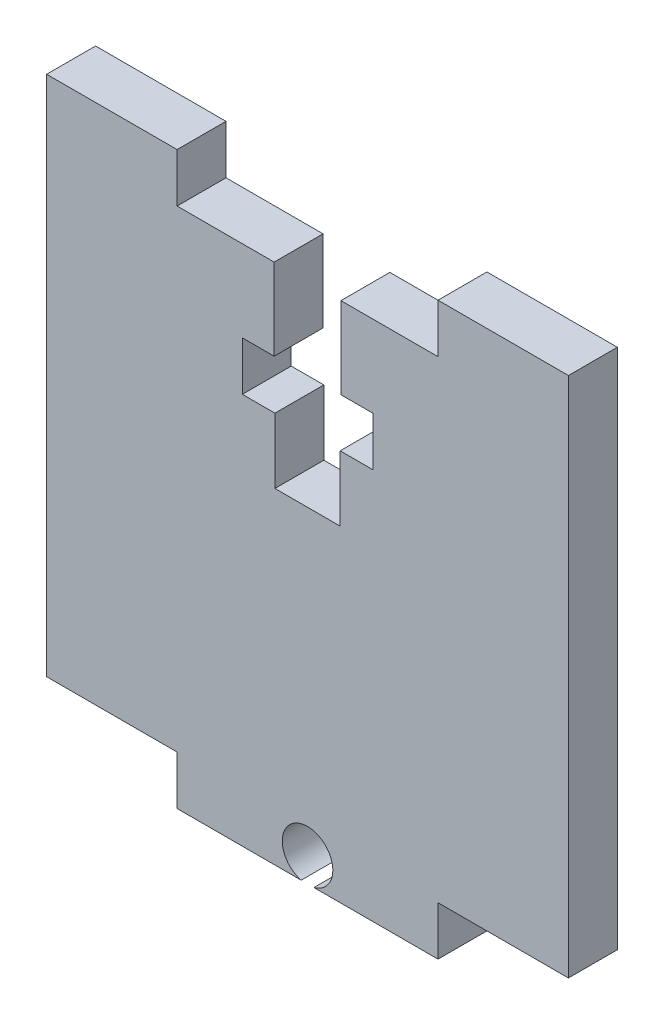
ISO-10303-21;
HEADER;
FILE_DESCRIPTION(('STEP AP214'),'2;1');
FILE_NAME('part.step','',(''),(''),'','','');
FILE_SCHEMA(('AUTOMOTIVE_DESIGN { 1 0 10303 214 1 1 1 1 }'));
ENDSEC;
DATA;
#1=APPLICATION_CONTEXT('core data for automotive mechanical design processes');
#2=APPLICATION_PROTOCOL_DEFINITION('international standard','automotive_design',2000,#1);
#3=PRODUCT_CONTEXT('',#1,'mechanical');
#4=PRODUCT('Part','Part','',(#3));
#5=PRODUCT_RELATED_PRODUCT_CATEGORY('part','',(#4));
#6=PRODUCT_DEFINITION_FORMATION('','',#4);
#7=PRODUCT_DEFINITION_CONTEXT('part definition',#1,'design');
#8=PRODUCT_DEFINITION('design','',#6,#7);
#9=PRODUCT_DEFINITION_SHAPE('','',#8);
#10=(LENGTH_UNIT() NAMED_UNIT(*) SI_UNIT(.MILLI.,.METRE.));
#11=(NAMED_UNIT(*) PLANE_ANGLE_UNIT() SI_UNIT($,.RADIAN.));
#12=(NAMED_UNIT(*) SI_UNIT($,.STERADIAN.) SOLID_ANGLE_UNIT());
#13=UNCERTAINTY_MEASURE_WITH_UNIT(LENGTH_MEASURE(1.E-05),#10,'distance_accuracy_value','');
#14=(GEOMETRIC_REPRESENTATION_CONTEXT(3) GLOBAL_UNCERTAINTY_ASSIGNED_CONTEXT((#13)) GLOBAL_UNIT_ASSIGNED_CONTEXT((#10,
#11,#12)) REPRESENTATION_CONTEXT('',''));
#15=CARTESIAN_POINT('',(0.,0.,0.));
#16=DIRECTION('',(0.,0.,1.));
#17=DIRECTION('',(1.,0.,0.));
#18=AXIS2_PLACEMENT_3D('',#15,#16,#17);
#19=CARTESIAN_POINT('',(8.,48.8553054771042,3.));
#20=DIRECTION('',(1.,0.,0.));
#21=DIRECTION('',(0.,0.,-1.));
#22=AXIS2_PLACEMENT_3D('',#19,#20,#21);
#23=PLANE('',#22);
#24=DIRECTION('',(0.,-1.,0.));
#25=VECTOR('',#24,1.);
#26=CARTESIAN_POINT('',(8.,48.8553054771042,0.));
#27=LINE('',#26,#25);
#28=CARTESIAN_POINT('',(8.,51.8553054771042,0.));
#29=VERTEX_POINT('',#28);
#30=CARTESIAN_POINT('',(8.,48.8553054771042,0.));
#31=VERTEX_POINT('',#30);
#32=EDGE_CURVE('E237',#29,#31,#27,.T.);
#33=ORIENTED_EDGE('',*,*,#32,.T.);
#34=DIRECTION('',(0.,0.,-1.));
#35=VECTOR('',#34,1.);
#36=CARTESIAN_POINT('',(8.,48.8553054771042,3.));
#37=LINE('',#36,#35);
#38=CARTESIAN_POINT('',(8.,48.8553054771042,3.));
#39=VERTEX_POINT('',#38);
#40=EDGE_CURVE('E11',#39,#31,#37,.T.);
#41=ORIENTED_EDGE('',*,*,#40,.F.);
#42=DIRECTION('',(0.,-1.,0.));
#43=VECTOR('',#42,1.);
#44=CARTESIAN_POINT('',(8.,48.8553054771042,3.));
#45=LINE('',#44,#43);
#46=CARTESIAN_POINT('',(8.,51.8553054771042,3.));
#47=VERTEX_POINT('',#46);
#48=EDGE_CURVE('E287',#47,#39,#45,.T.);
#49=ORIENTED_EDGE('',*,*,#48,.F.);
#50=DIRECTION('',(0.,0.,-1.));
#51=VECTOR('',#50,1.);
#52=CARTESIAN_POINT('',(8.,51.8553054771042,3.));
#53=LINE('',#52,#51);
#54=EDGE_CURVE('E233',#47,#29,#53,.T.);
#55=ORIENTED_EDGE('',*,*,#54,.T.);
#56=EDGE_LOOP('',(#33,#41,#49,#55));
#57=FACE_BOUND('',#56,.T.);
#58=ADVANCED_FACE('F33',(#57),#23,.F.);
#59=CARTESIAN_POINT('',(2.04789002341845,48.8553054771042,3.));
#60=DIRECTION('',(0.,-1.,0.));
#61=DIRECTION('',(0.,0.,-1.));
#62=AXIS2_PLACEMENT_3D('',#59,#60,#61);
#63=PLANE('',#62);
#64=DIRECTION('',(-1.,0.,0.));
#65=VECTOR('',#64,1.);
#66=CARTESIAN_POINT('',(2.04789002341845,48.8553054771042,0.));
#67=LINE('',#66,#65);
#68=CARTESIAN_POINT('',(2.04789002341845,48.8553054771042,0.));
#69=VERTEX_POINT('',#68);
#70=EDGE_CURVE('E240',#31,#69,#67,.T.);
#71=ORIENTED_EDGE('',*,*,#70,.T.);
#72=DIRECTION('',(0.,0.,-1.));
#73=VECTOR('',#72,1.);
#74=CARTESIAN_POINT('',(2.04789002341845,48.8553054771042,3.));
#75=LINE('',#74,#73);
#76=CARTESIAN_POINT('',(2.04789002341845,48.8553054771042,3.));
#77=VERTEX_POINT('',#76);
#78=EDGE_CURVE('E41',#77,#69,#75,.T.);
#79=ORIENTED_EDGE('',*,*,#78,.F.);
#80=DIRECTION('',(-1.,0.,0.));
#81=VECTOR('',#80,1.);
#82=CARTESIAN_POINT('',(2.04789002341845,48.8553054771042,3.));
#83=LINE('',#82,#81);
#84=EDGE_CURVE('E146',#39,#77,#83,.T.);
#85=ORIENTED_EDGE('',*,*,#84,.F.);
#86=ORIENTED_EDGE('',*,*,#40,.T.);
#87=EDGE_LOOP('',(#71,#79,#85,#86));
#88=FACE_BOUND('',#87,.T.);
#89=ADVANCED_FACE('F435',(#88),#63,.F.);
#90=CARTESIAN_POINT('',(2.04789002341845,48.8553054771042,3.));
#91=DIRECTION('',(1.,0.,0.));
#92=DIRECTION('',(0.,1.,0.));
#93=AXIS2_PLACEMENT_3D('',#90,#91,#92);
#94=PLANE('',#93);
#95=DIRECTION('',(0.,-1.,0.));
#96=VECTOR('',#95,1.);
#97=CARTESIAN_POINT('',(2.04789002341845,48.8553054771042,0.));
#98=LINE('',#97,#96);
#99=CARTESIAN_POINT('',(2.04789002341845,43.8553054771042,0.));
#100=VERTEX_POINT('',#99);
#101=EDGE_CURVE('E242',#69,#100,#98,.T.);
#102=ORIENTED_EDGE('',*,*,#101,.T.);
#103=DIRECTION('',(0.,0.,-1.));
#104=VECTOR('',#103,1.);
#105=CARTESIAN_POINT('',(2.04789002341845,43.8553054771042,3.));
#106=LINE('',#105,#104);
#107=CARTESIAN_POINT('',(2.04789002341845,43.8553054771042,3.));
#108=VERTEX_POINT('',#107);
#109=EDGE_CURVE('E348',#108,#100,#106,.T.);
#110=ORIENTED_EDGE('',*,*,#109,.F.);
#111=DIRECTION('',(0.,-1.,0.));
#112=VECTOR('',#111,1.);
#113=CARTESIAN_POINT('',(2.04789002341845,48.8553054771042,3.));
#114=LINE('',#113,#112);
#115=EDGE_CURVE('E356',#77,#108,#114,.T.);
#116=ORIENTED_EDGE('',*,*,#115,.F.);
#117=ORIENTED_EDGE('',*,*,#78,.T.);
#118=EDGE_LOOP('',(#102,#110,#116,#117));
#119=FACE_BOUND('',#118,.T.);
#120=ADVANCED_FACE('F354',(#119),#94,.F.);
#121=CARTESIAN_POINT('',(2.04789002341845,43.8553054771042,3.));
#122=DIRECTION('',(0.,1.,0.));
#123=DIRECTION('',(-1.,0.,0.));
#124=AXIS2_PLACEMENT_3D('',#121,#122,#123);
#125=PLANE('',#124);
#126=DIRECTION('',(1.,0.,0.));
#127=VECTOR('',#126,1.);
#128=CARTESIAN_POINT('',(2.04789002341845,43.8553054771042,0.));
#129=LINE('',#128,#127);
#130=CARTESIAN_POINT('',(4.,43.8553054771042,0.));
#131=VERTEX_POINT('',#130);
#132=EDGE_CURVE('E244',#100,#131,#129,.T.);
#133=ORIENTED_EDGE('',*,*,#132,.T.);
#134=DIRECTION('',(0.,0.,-1.));
#135=VECTOR('',#134,1.);
#136=CARTESIAN_POINT('',(4.,43.8553054771042,3.));
#137=LINE('',#136,#135);
#138=CARTESIAN_POINT('',(4.,43.8553054771042,3.));
#139=VERTEX_POINT('',#138);
#140=EDGE_CURVE('E345',#139,#131,#137,.T.);
#141=ORIENTED_EDGE('',*,*,#140,.F.);
#142=DIRECTION('',(1.,0.,0.));
#143=VECTOR('',#142,1.);
#144=CARTESIAN_POINT('',(2.04789002341845,43.8553054771042,3.));
#145=LINE('',#144,#143);
#146=EDGE_CURVE('E374',#108,#139,#145,.T.);
#147=ORIENTED_EDGE('',*,*,#146,.F.);
#148=ORIENTED_EDGE('',*,*,#109,.T.);
#149=EDGE_LOOP('',(#133,#141,#147,#148));
#150=FACE_BOUND('',#149,.T.);
#151=ADVANCED_FACE('F365',(#150),#125,.F.);
#152=CARTESIAN_POINT('',(4.,43.8553054771042,3.));
#153=DIRECTION('',(1.,0.,0.));
#154=DIRECTION('',(0.,1.,0.));
#155=AXIS2_PLACEMENT_3D('',#152,#153,#154);
#156=PLANE('',#155);
#157=DIRECTION('',(0.,-1.,0.));
#158=VECTOR('',#157,1.);
#159=CARTESIAN_POINT('',(4.,43.8553054771042,0.));
#160=LINE('',#159,#158);
#161=CARTESIAN_POINT('',(4.,40.8553054771042,0.));
#162=VERTEX_POINT('',#161);
#163=EDGE_CURVE('E246',#131,#162,#160,.T.);
#164=ORIENTED_EDGE('',*,*,#163,.T.);
#165=DIRECTION('',(0.,0.,-1.));
#166=VECTOR('',#165,1.);
#167=CARTESIAN_POINT('',(4.,40.8553054771042,3.));
#168=LINE('',#167,#166);
#169=CARTESIAN_POINT('',(4.,40.8553054771042,3.));
#170=VERTEX_POINT('',#169);
#171=EDGE_CURVE('E342',#170,#162,#168,.T.);
#172=ORIENTED_EDGE('',*,*,#171,.F.);
#173=DIRECTION('',(0.,-1.,0.));
#174=VECTOR('',#173,1.);
#175=CARTESIAN_POINT('',(4.,43.8553054771042,3.));
#176=LINE('',#175,#174);
#177=EDGE_CURVE('E371',#139,#170,#176,.T.);
#178=ORIENTED_EDGE('',*,*,#177,.F.);
#179=ORIENTED_EDGE('',*,*,#140,.T.);
#180=EDGE_LOOP('',(#164,#172,#178,#179));
#181=FACE_BOUND('',#180,.T.);
#182=ADVANCED_FACE('F369',(#181),#156,.F.);
#183=CARTESIAN_POINT('',(4.,40.8553054771042,3.));
#184=DIRECTION('',(0.,-1.,0.));
#185=DIRECTION('',(0.,0.,-1.));
#186=AXIS2_PLACEMENT_3D('',#183,#184,#185);
#187=PLANE('',#186);
#188=DIRECTION('',(-1.,0.,0.));
#189=VECTOR('',#188,1.);
#190=CARTESIAN_POINT('',(4.,40.8553054771042,0.));
#191=LINE('',#190,#189);
#192=CARTESIAN_POINT('',(2.,40.8553054771042,0.));
#193=VERTEX_POINT('',#192);
#194=EDGE_CURVE('E248',#162,#193,#191,.T.);
#195=ORIENTED_EDGE('',*,*,#194,.T.);
#196=DIRECTION('',(0.,0.,-1.));
#197=VECTOR('',#196,1.);
#198=CARTESIAN_POINT('',(2.,40.8553054771042,3.));
#199=LINE('',#198,#197);
#200=CARTESIAN_POINT('',(2.,40.8553054771042,3.));
#201=VERTEX_POINT('',#200);
#202=EDGE_CURVE('E339',#201,#193,#199,.T.);
#203=ORIENTED_EDGE('',*,*,#202,.F.);
#204=DIRECTION('',(-1.,0.,0.));
#205=VECTOR('',#204,1.);
#206=CARTESIAN_POINT('',(4.,40.8553054771042,3.));
#207=LINE('',#206,#205);
#208=EDGE_CURVE('E373',#170,#201,#207,.T.);
#209=ORIENTED_EDGE('',*,*,#208,.F.);
#210=ORIENTED_EDGE('',*,*,#171,.T.);
#211=EDGE_LOOP('',(#195,#203,#209,#210));
#212=FACE_BOUND('',#211,.T.);
#213=ADVANCED_FACE('F448',(#212),#187,.F.);
#214=CARTESIAN_POINT('',(2.,40.8553054771042,3.));
#215=DIRECTION('',(1.,0.,0.));
#216=DIRECTION('',(0.,1.,0.));
#217=AXIS2_PLACEMENT_3D('',#214,#215,#216);
#218=PLANE('',#217);
#219=DIRECTION('',(0.,-1.,0.));
#220=VECTOR('',#219,1.);
#221=CARTESIAN_POINT('',(2.,40.8553054771042,0.));
#222=LINE('',#221,#220);
#223=CARTESIAN_POINT('',(2.,36.8553054771042,0.));
#224=VERTEX_POINT('',#223);
#225=EDGE_CURVE('E250',#193,#224,#222,.T.);
#226=ORIENTED_EDGE('',*,*,#225,.T.);
#227=DIRECTION('',(0.,0.,-1.));
#228=VECTOR('',#227,1.);
#229=CARTESIAN_POINT('',(2.,36.8553054771042,3.));
#230=LINE('',#229,#228);
#231=CARTESIAN_POINT('',(2.,36.8553054771042,3.));
#232=VERTEX_POINT('',#231);
#233=EDGE_CURVE('E336',#232,#224,#230,.T.);
#234=ORIENTED_EDGE('',*,*,#233,.F.);
#235=DIRECTION('',(0.,-1.,0.));
#236=VECTOR('',#235,1.);
#237=CARTESIAN_POINT('',(2.,40.8553054771042,3.));
#238=LINE('',#237,#236);
#239=EDGE_CURVE('E376',#201,#232,#238,.T.);
#240=ORIENTED_EDGE('',*,*,#239,.F.);
#241=ORIENTED_EDGE('',*,*,#202,.T.);
#242=EDGE_LOOP('',(#226,#234,#240,#241));
#243=FACE_BOUND('',#242,.T.);
#244=ADVANCED_FACE('F451',(#243),#218,.F.);
#245=CARTESIAN_POINT('',(2.,36.8553054771042,3.));
#246=DIRECTION('',(0.,-1.,0.));
#247=DIRECTION('',(0.,0.,-1.));
#248=AXIS2_PLACEMENT_3D('',#245,#246,#247);
#249=PLANE('',#248);
#250=DIRECTION('',(-1.,0.,0.));
#251=VECTOR('',#250,1.);
#252=CARTESIAN_POINT('',(2.,36.8553054771042,0.));
#253=LINE('',#252,#251);
#254=CARTESIAN_POINT('',(-2.,36.8553054771042,0.));
#255=VERTEX_POINT('',#254);
#256=EDGE_CURVE('E252',#224,#255,#253,.T.);
#257=ORIENTED_EDGE('',*,*,#256,.T.);
#258=DIRECTION('',(0.,0.,-1.));
#259=VECTOR('',#258,1.);
#260=CARTESIAN_POINT('',(-2.,36.8553054771042,3.));
#261=LINE('',#260,#259);
#262=CARTESIAN_POINT('',(-2.,36.8553054771042,3.));
#263=VERTEX_POINT('',#262);
#264=EDGE_CURVE('E333',#263,#255,#261,.T.);
#265=ORIENTED_EDGE('',*,*,#264,.F.);
#266=DIRECTION('',(-1.,0.,0.));
#267=VECTOR('',#266,1.);
#268=CARTESIAN_POINT('',(2.,36.8553054771042,3.));
#269=LINE('',#268,#267);
#270=EDGE_CURVE('E382',#232,#263,#269,.T.);
#271=ORIENTED_EDGE('',*,*,#270,.F.);
#272=ORIENTED_EDGE('',*,*,#233,.T.);
#273=EDGE_LOOP('',(#257,#265,#271,#272));
#274=FACE_BOUND('',#273,.T.);
#275=ADVANCED_FACE('F455',(#274),#249,.F.);
#276=CARTESIAN_POINT('',(-2.,40.8553054771042,3.));
#277=DIRECTION('',(-1.,0.,0.));
#278=DIRECTION('',(0.,-1.,0.));
#279=AXIS2_PLACEMENT_3D('',#276,#277,#278);
#280=PLANE('',#279);
#281=DIRECTION('',(0.,1.,0.));
#282=VECTOR('',#281,1.);
#283=CARTESIAN_POINT('',(-2.,40.8553054771042,0.));
#284=LINE('',#283,#282);
#285=CARTESIAN_POINT('',(-2.,40.8553054771042,0.));
#286=VERTEX_POINT('',#285);
#287=EDGE_CURVE('E254',#255,#286,#284,.T.);
#288=ORIENTED_EDGE('',*,*,#287,.T.);
#289=DIRECTION('',(0.,0.,-1.));
#290=VECTOR('',#289,1.);
#291=CARTESIAN_POINT('',(-2.,40.8553054771042,3.));
#292=LINE('',#291,#290);
#293=CARTESIAN_POINT('',(-2.,40.8553054771042,3.));
#294=VERTEX_POINT('',#293);
#295=EDGE_CURVE('E330',#294,#286,#292,.T.);
#296=ORIENTED_EDGE('',*,*,#295,.F.);
#297=DIRECTION('',(0.,1.,0.));
#298=VECTOR('',#297,1.);
#299=CARTESIAN_POINT('',(-2.,40.8553054771042,3.));
#300=LINE('',#299,#298);
#301=EDGE_CURVE('E384',#263,#294,#300,.T.);
#302=ORIENTED_EDGE('',*,*,#301,.F.);
#303=ORIENTED_EDGE('',*,*,#264,.T.);
#304=EDGE_LOOP('',(#288,#296,#302,#303));
#305=FACE_BOUND('',#304,.T.);
#306=ADVANCED_FACE('F459',(#305),#280,.F.);
#307=CARTESIAN_POINT('',(-4.00000000000001,40.8553054771042,3.));
#308=DIRECTION('',(0.,-1.,0.));
#309=DIRECTION('',(0.,0.,-1.));
#310=AXIS2_PLACEMENT_3D('',#307,#308,#309);
#311=PLANE('',#310);
#312=DIRECTION('',(-1.,0.,0.));
#313=VECTOR('',#312,1.);
#314=CARTESIAN_POINT('',(-4.00000000000001,40.8553054771042,0.));
#315=LINE('',#314,#313);
#316=CARTESIAN_POINT('',(-4.00000000000001,40.8553054771042,0.));
#317=VERTEX_POINT('',#316);
#318=EDGE_CURVE('E256',#286,#317,#315,.T.);
#319=ORIENTED_EDGE('',*,*,#318,.T.);
#320=DIRECTION('',(0.,0.,-1.));
#321=VECTOR('',#320,1.);
#322=CARTESIAN_POINT('',(-4.00000000000001,40.8553054771042,3.));
#323=LINE('',#322,#321);
#324=CARTESIAN_POINT('',(-4.00000000000001,40.8553054771042,3.));
#325=VERTEX_POINT('',#324);
#326=EDGE_CURVE('E327',#325,#317,#323,.T.);
#327=ORIENTED_EDGE('',*,*,#326,.F.);
#328=DIRECTION('',(-1.,0.,0.));
#329=VECTOR('',#328,1.);
#330=CARTESIAN_POINT('',(-4.00000000000001,40.8553054771042,3.));
#331=LINE('',#330,#329);
#332=EDGE_CURVE('E386',#294,#325,#331,.T.);
#333=ORIENTED_EDGE('',*,*,#332,.F.);
#334=ORIENTED_EDGE('',*,*,#295,.T.);
#335=EDGE_LOOP('',(#319,#327,#333,#334));
#336=FACE_BOUND('',#335,.T.);
#337=ADVANCED_FACE('F463',(#336),#311,.F.);
#338=CARTESIAN_POINT('',(-4.,43.8553054771042,3.));
#339=DIRECTION('',(-1.,0.,0.));
#340=DIRECTION('',(0.,-1.,0.));
#341=AXIS2_PLACEMENT_3D('',#338,#339,#340);
#342=PLANE('',#341);
#343=DIRECTION('',(0.,1.,0.));
#344=VECTOR('',#343,1.);
#345=CARTESIAN_POINT('',(-4.,43.8553054771042,0.));
#346=LINE('',#345,#344);
#347=CARTESIAN_POINT('',(-4.,43.8553054771042,0.));
#348=VERTEX_POINT('',#347);
#349=EDGE_CURVE('E258',#317,#348,#346,.T.);
#350=ORIENTED_EDGE('',*,*,#349,.T.);
#351=DIRECTION('',(0.,0.,-1.));
#352=VECTOR('',#351,1.);
#353=CARTESIAN_POINT('',(-4.,43.8553054771042,3.));
#354=LINE('',#353,#352);
#355=CARTESIAN_POINT('',(-4.,43.8553054771042,3.));
#356=VERTEX_POINT('',#355);
#357=EDGE_CURVE('E324',#356,#348,#354,.T.);
#358=ORIENTED_EDGE('',*,*,#357,.F.);
#359=DIRECTION('',(0.,1.,0.));
#360=VECTOR('',#359,1.);
#361=CARTESIAN_POINT('',(-4.,43.8553054771042,3.));
#362=LINE('',#361,#360);
#363=EDGE_CURVE('E388',#325,#356,#362,.T.);
#364=ORIENTED_EDGE('',*,*,#363,.F.);
#365=ORIENTED_EDGE('',*,*,#326,.T.);
#366=EDGE_LOOP('',(#350,#358,#364,#365));
#367=FACE_BOUND('',#366,.T.);
#368=ADVANCED_FACE('F467',(#367),#342,.F.);
#369=CARTESIAN_POINT('',(-2.04789002341846,43.8553054771042,3.));
#370=DIRECTION('',(0.,1.,0.));
#371=DIRECTION('',(-1.,0.,0.));
#372=AXIS2_PLACEMENT_3D('',#369,#370,#371);
#373=PLANE('',#372);
#374=DIRECTION('',(1.,0.,0.));
#375=VECTOR('',#374,1.);
#376=CARTESIAN_POINT('',(-2.04789002341846,43.8553054771042,0.));
#377=LINE('',#376,#375);
#378=CARTESIAN_POINT('',(-2.04789002341846,43.8553054771042,0.));
#379=VERTEX_POINT('',#378);
#380=EDGE_CURVE('E260',#348,#379,#377,.T.);
#381=ORIENTED_EDGE('',*,*,#380,.T.);
#382=DIRECTION('',(0.,0.,-1.));
#383=VECTOR('',#382,1.);
#384=CARTESIAN_POINT('',(-2.04789002341846,43.8553054771042,3.));
#385=LINE('',#384,#383);
#386=CARTESIAN_POINT('',(-2.04789002341846,43.8553054771042,3.));
#387=VERTEX_POINT('',#386);
#388=EDGE_CURVE('E321',#387,#379,#385,.T.);
#389=ORIENTED_EDGE('',*,*,#388,.F.);
#390=DIRECTION('',(1.,0.,0.));
#391=VECTOR('',#390,1.);
#392=CARTESIAN_POINT('',(-2.04789002341846,43.8553054771042,3.));
#393=LINE('',#392,#391);
#394=EDGE_CURVE('E390',#356,#387,#393,.T.);
#395=ORIENTED_EDGE('',*,*,#394,.F.);
#396=ORIENTED_EDGE('',*,*,#357,.T.);
#397=EDGE_LOOP('',(#381,#389,#395,#396));
#398=FACE_BOUND('',#397,.T.);
#399=ADVANCED_FACE('F471',(#398),#373,.F.);
#400=CARTESIAN_POINT('',(-2.04789002341846,48.8553054771042,3.));
#401=DIRECTION('',(-1.,0.,0.));
#402=DIRECTION('',(0.,-1.,0.));
#403=AXIS2_PLACEMENT_3D('',#400,#401,#402);
#404=PLANE('',#403);
#405=DIRECTION('',(0.,1.,0.));
#406=VECTOR('',#405,1.);
#407=CARTESIAN_POINT('',(-2.04789002341846,48.8553054771042,0.));
#408=LINE('',#407,#406);
#409=CARTESIAN_POINT('',(-2.04789002341846,48.8553054771042,0.));
#410=VERTEX_POINT('',#409);
#411=EDGE_CURVE('E262',#379,#410,#408,.T.);
#412=ORIENTED_EDGE('',*,*,#411,.T.);
#413=DIRECTION('',(0.,0.,-1.));
#414=VECTOR('',#413,1.);
#415=CARTESIAN_POINT('',(-2.04789002341846,48.8553054771042,3.));
#416=LINE('',#415,#414);
#417=CARTESIAN_POINT('',(-2.04789002341846,48.8553054771042,3.));
#418=VERTEX_POINT('',#417);
#419=EDGE_CURVE('E318',#418,#410,#416,.T.);
#420=ORIENTED_EDGE('',*,*,#419,.F.);
#421=DIRECTION('',(0.,1.,0.));
#422=VECTOR('',#421,1.);
#423=CARTESIAN_POINT('',(-2.04789002341846,48.8553054771042,3.));
#424=LINE('',#423,#422);
#425=EDGE_CURVE('E392',#387,#418,#424,.T.);
#426=ORIENTED_EDGE('',*,*,#425,.F.);
#427=ORIENTED_EDGE('',*,*,#388,.T.);
#428=EDGE_LOOP('',(#412,#420,#426,#427));
#429=FACE_BOUND('',#428,.T.);
#430=ADVANCED_FACE('F475',(#429),#404,.F.);
#431=CARTESIAN_POINT('',(-2.04789002341846,48.8553054771042,3.));
#432=DIRECTION('',(0.,-1.,0.));
#433=DIRECTION('',(0.,0.,-1.));
#434=AXIS2_PLACEMENT_3D('',#431,#432,#433);
#435=PLANE('',#434);
#436=DIRECTION('',(-1.,0.,0.));
#437=VECTOR('',#436,1.);
#438=CARTESIAN_POINT('',(-2.04789002341846,48.8553054771042,0.));
#439=LINE('',#438,#437);
#440=CARTESIAN_POINT('',(-8.00000000000001,48.8553054771042,0.));
#441=VERTEX_POINT('',#440);
#442=EDGE_CURVE('E264',#410,#441,#439,.T.);
#443=ORIENTED_EDGE('',*,*,#442,.T.);
#444=DIRECTION('',(0.,0.,-1.));
#445=VECTOR('',#444,1.);
#446=CARTESIAN_POINT('',(-8.00000000000001,48.8553054771042,3.));
#447=LINE('',#446,#445);
#448=CARTESIAN_POINT('',(-8.00000000000001,48.8553054771042,3.));
#449=VERTEX_POINT('',#448);
#450=EDGE_CURVE('E315',#449,#441,#447,.T.);
#451=ORIENTED_EDGE('',*,*,#450,.F.);
#452=DIRECTION('',(-1.,0.,0.));
#453=VECTOR('',#452,1.);
#454=CARTESIAN_POINT('',(-2.04789002341846,48.8553054771042,3.));
#455=LINE('',#454,#453);
#456=EDGE_CURVE('E394',#418,#449,#455,.T.);
#457=ORIENTED_EDGE('',*,*,#456,.F.);
#458=ORIENTED_EDGE('',*,*,#419,.T.);
#459=EDGE_LOOP('',(#443,#451,#457,#458));
#460=FACE_BOUND('',#459,.T.);
#461=ADVANCED_FACE('F479',(#460),#435,.F.);
#462=CARTESIAN_POINT('',(-8.00000000000001,48.8553054771042,3.));
#463=DIRECTION('',(-1.,0.,0.));
#464=DIRECTION('',(0.,0.,1.));
#465=AXIS2_PLACEMENT_3D('',#462,#463,#464);
#466=PLANE('',#465);
#467=DIRECTION('',(0.,1.,0.));
#468=VECTOR('',#467,1.);
#469=CARTESIAN_POINT('',(-8.00000000000001,48.8553054771042,0.));
#470=LINE('',#469,#468);
#471=CARTESIAN_POINT('',(-8.00000000000001,51.8553054771042,0.));
#472=VERTEX_POINT('',#471);
#473=EDGE_CURVE('E266',#441,#472,#470,.T.);
#474=ORIENTED_EDGE('',*,*,#473,.T.);
#475=DIRECTION('',(0.,0.,-1.));
#476=VECTOR('',#475,1.);
#477=CARTESIAN_POINT('',(-8.00000000000001,51.8553054771042,3.));
#478=LINE('',#477,#476);
#479=CARTESIAN_POINT('',(-8.00000000000001,51.8553054771042,3.));
#480=VERTEX_POINT('',#479);
#481=EDGE_CURVE('E312',#480,#472,#478,.T.);
#482=ORIENTED_EDGE('',*,*,#481,.F.);
#483=DIRECTION('',(0.,1.,0.));
#484=VECTOR('',#483,1.);
#485=CARTESIAN_POINT('',(-8.00000000000001,48.8553054771042,3.));
#486=LINE('',#485,#484);
#487=EDGE_CURVE('E396',#449,#480,#486,.T.);
#488=ORIENTED_EDGE('',*,*,#487,.F.);
#489=ORIENTED_EDGE('',*,*,#450,.T.);
#490=EDGE_LOOP('',(#474,#482,#488,#489));
#491=FACE_BOUND('',#490,.T.);
#492=ADVANCED_FACE('F483',(#491),#466,.F.);
#493=CARTESIAN_POINT('',(-8.00000000000001,51.8553054771042,3.));
#494=DIRECTION('',(0.,-1.,0.));
#495=DIRECTION('',(0.,0.,-1.));
#496=AXIS2_PLACEMENT_3D('',#493,#494,#495);
#497=PLANE('',#496);
#498=DIRECTION('',(-1.,0.,0.));
#499=VECTOR('',#498,1.);
#500=CARTESIAN_POINT('',(-8.00000000000001,51.8553054771042,0.));
#501=LINE('',#500,#499);
#502=CARTESIAN_POINT('',(-16.,51.8553054771042,0.));
#503=VERTEX_POINT('',#502);
#504=EDGE_CURVE('E268',#472,#503,#501,.T.);
#505=ORIENTED_EDGE('',*,*,#504,.T.);
#506=DIRECTION('',(0.,0.,-1.));
#507=VECTOR('',#506,1.);
#508=CARTESIAN_POINT('',(-16.,51.8553054771042,3.));
#509=LINE('',#508,#507);
#510=CARTESIAN_POINT('',(-16.,51.8553054771042,3.));
#511=VERTEX_POINT('',#510);
#512=EDGE_CURVE('E309',#511,#503,#509,.T.);
#513=ORIENTED_EDGE('',*,*,#512,.F.);
#514=DIRECTION('',(-1.,0.,0.));
#515=VECTOR('',#514,1.);
#516=CARTESIAN_POINT('',(-8.00000000000001,51.8553054771042,3.));
#517=LINE('',#516,#515);
#518=EDGE_CURVE('E398',#480,#511,#517,.T.);
#519=ORIENTED_EDGE('',*,*,#518,.F.);
#520=ORIENTED_EDGE('',*,*,#481,.T.);
#521=EDGE_LOOP('',(#505,#513,#519,#520));
#522=FACE_BOUND('',#521,.T.);
#523=ADVANCED_FACE('F487',(#522),#497,.F.);
#524=CARTESIAN_POINT('',(-16.,51.8553054771042,3.));
#525=DIRECTION('',(1.,0.,0.));
#526=DIRECTION('',(0.,0.,-1.));
#527=AXIS2_PLACEMENT_3D('',#524,#525,#526);
#528=PLANE('',#527);
#529=DIRECTION('',(0.,-1.,0.));
#530=VECTOR('',#529,1.);
#531=CARTESIAN_POINT('',(-16.,51.8553054771042,0.));
#532=LINE('',#531,#530);
#533=CARTESIAN_POINT('',(-16.,19.8553054771042,0.));
#534=VERTEX_POINT('',#533);
#535=EDGE_CURVE('E270',#503,#534,#532,.T.);
#536=ORIENTED_EDGE('',*,*,#535,.T.);
#537=DIRECTION('',(0.,0.,-1.));
#538=VECTOR('',#537,1.);
#539=CARTESIAN_POINT('',(-16.,19.8553054771042,3.));
#540=LINE('',#539,#538);
#541=CARTESIAN_POINT('',(-16.,19.8553054771042,3.));
#542=VERTEX_POINT('',#541);
#543=EDGE_CURVE('E306',#542,#534,#540,.T.);
#544=ORIENTED_EDGE('',*,*,#543,.F.);
#545=DIRECTION('',(0.,-1.,0.));
#546=VECTOR('',#545,1.);
#547=CARTESIAN_POINT('',(-16.,51.8553054771042,3.));
#548=LINE('',#547,#546);
#549=EDGE_CURVE('E400',#511,#542,#548,.T.);
#550=ORIENTED_EDGE('',*,*,#549,.F.);
#551=ORIENTED_EDGE('',*,*,#512,.T.);
#552=EDGE_LOOP('',(#536,#544,#550,#551));
#553=FACE_BOUND('',#552,.T.);
#554=ADVANCED_FACE('F491',(#553),#528,.F.);
#555=CARTESIAN_POINT('',(-16.,19.8553054771042,3.));
#556=DIRECTION('',(0.,1.,0.));
#557=DIRECTION('',(0.,0.,1.));
#558=AXIS2_PLACEMENT_3D('',#555,#556,#557);
#559=PLANE('',#558);
#560=DIRECTION('',(1.,0.,0.));
#561=VECTOR('',#560,1.);
#562=CARTESIAN_POINT('',(-16.,19.8553054771042,0.));
#563=LINE('',#562,#561);
#564=CARTESIAN_POINT('',(-8.00000000000001,19.8553054771042,0.));
#565=VERTEX_POINT('',#564);
#566=EDGE_CURVE('E272',#534,#565,#563,.T.);
#567=ORIENTED_EDGE('',*,*,#566,.T.);
#568=DIRECTION('',(0.,0.,-1.));
#569=VECTOR('',#568,1.);
#570=CARTESIAN_POINT('',(-8.00000000000001,19.8553054771042,3.));
#571=LINE('',#570,#569);
#572=CARTESIAN_POINT('',(-8.00000000000001,19.8553054771042,3.));
#573=VERTEX_POINT('',#572);
#574=EDGE_CURVE('E303',#573,#565,#571,.T.);
#575=ORIENTED_EDGE('',*,*,#574,.F.);
#576=DIRECTION('',(1.,0.,0.));
#577=VECTOR('',#576,1.);
#578=CARTESIAN_POINT('',(-16.,19.8553054771042,3.));
#579=LINE('',#578,#577);
#580=EDGE_CURVE('E402',#542,#573,#579,.T.);
#581=ORIENTED_EDGE('',*,*,#580,.F.);
#582=ORIENTED_EDGE('',*,*,#543,.T.);
#583=EDGE_LOOP('',(#567,#575,#581,#582));
#584=FACE_BOUND('',#583,.T.);
#585=ADVANCED_FACE('F495',(#584),#559,.F.);
#586=CARTESIAN_POINT('',(-8.00000000000001,16.8553054771042,3.));
#587=DIRECTION('',(1.,0.,0.));
#588=DIRECTION('',(0.,0.,-1.));
#589=AXIS2_PLACEMENT_3D('',#586,#587,#588);
#590=PLANE('',#589);
#591=DIRECTION('',(0.,-1.,0.));
#592=VECTOR('',#591,1.);
#593=CARTESIAN_POINT('',(-8.00000000000001,16.8553054771042,0.));
#594=LINE('',#593,#592);
#595=CARTESIAN_POINT('',(-8.00000000000001,16.8553054771042,0.));
#596=VERTEX_POINT('',#595);
#597=EDGE_CURVE('E274',#565,#596,#594,.T.);
#598=ORIENTED_EDGE('',*,*,#597,.T.);
#599=DIRECTION('',(0.,0.,-1.));
#600=VECTOR('',#599,1.);
#601=CARTESIAN_POINT('',(-8.00000000000001,16.8553054771042,3.));
#602=LINE('',#601,#600);
#603=CARTESIAN_POINT('',(-8.00000000000001,16.8553054771042,3.));
#604=VERTEX_POINT('',#603);
#605=EDGE_CURVE('E300',#604,#596,#602,.T.);
#606=ORIENTED_EDGE('',*,*,#605,.F.);
#607=DIRECTION('',(0.,-1.,0.));
#608=VECTOR('',#607,1.);
#609=CARTESIAN_POINT('',(-8.00000000000001,16.8553054771042,3.));
#610=LINE('',#609,#608);
#611=EDGE_CURVE('E404',#573,#604,#610,.T.);
#612=ORIENTED_EDGE('',*,*,#611,.F.);
#613=ORIENTED_EDGE('',*,*,#574,.T.);
#614=EDGE_LOOP('',(#598,#606,#612,#613));
#615=FACE_BOUND('',#614,.T.);
#616=ADVANCED_FACE('F499',(#615),#590,.F.);
#617=CARTESIAN_POINT('',(-8.00000000000001,16.8553054771042,3.));
#618=DIRECTION('',(0.,1.,0.));
#619=DIRECTION('',(-1.,0.,0.));
#620=AXIS2_PLACEMENT_3D('',#617,#618,#619);
#621=PLANE('',#620);
#622=DIRECTION('',(1.,0.,0.));
#623=VECTOR('',#622,1.);
#624=CARTESIAN_POINT('',(-8.00000000000001,16.8553054771042,0.));
#625=LINE('',#624,#623);
#626=CARTESIAN_POINT('',(-0.390512483795328,16.8553054771042,0.));
#627=VERTEX_POINT('',#626);
#628=EDGE_CURVE('E276',#596,#627,#625,.T.);
#629=ORIENTED_EDGE('',*,*,#628,.T.);
#630=DIRECTION('',(0.,0.,-1.));
#631=VECTOR('',#630,1.);
#632=CARTESIAN_POINT('',(-0.390512483795328,16.8553054771042,3.));
#633=LINE('',#632,#631);
#634=CARTESIAN_POINT('',(-0.390512483795328,16.8553054771042,3.));
#635=VERTEX_POINT('',#634);
#636=EDGE_CURVE('E297',#635,#627,#633,.T.);
#637=ORIENTED_EDGE('',*,*,#636,.F.);
#638=DIRECTION('',(1.,0.,0.));
#639=VECTOR('',#638,1.);
#640=CARTESIAN_POINT('',(-8.00000000000001,16.8553054771042,3.));
#641=LINE('',#640,#639);
#642=EDGE_CURVE('E406',#604,#635,#641,.T.);
#643=ORIENTED_EDGE('',*,*,#642,.F.);
#644=ORIENTED_EDGE('',*,*,#605,.T.);
#645=EDGE_LOOP('',(#629,#637,#643,#644));
#646=FACE_BOUND('',#645,.T.);
#647=ADVANCED_FACE('F503',(#646),#621,.F.);
#648=CARTESIAN_POINT('',(0.,18.3553054771042,3.));
#649=DIRECTION('',(0.,0.,-1.));
#650=DIRECTION('',(-1.,0.,0.));
#651=AXIS2_PLACEMENT_3D('',#648,#649,#650);
#652=CYLINDRICAL_SURFACE('',#651,1.55);
#653=CARTESIAN_POINT('',(0.,18.3553054771042,0.));
#654=DIRECTION('',(0.,0.,-1.));
#655=DIRECTION('',(1.,0.,0.));
#656=AXIS2_PLACEMENT_3D('',#653,#654,#655);
#657=CIRCLE('',#656,1.55);
#658=CARTESIAN_POINT('',(0.390512483795337,16.8553054771042,0.));
#659=VERTEX_POINT('',#658);
#660=EDGE_CURVE('E278',#627,#659,#657,.T.);
#661=ORIENTED_EDGE('',*,*,#660,.T.);
#662=DIRECTION('',(0.,0.,-1.));
#663=VECTOR('',#662,1.);
#664=CARTESIAN_POINT('',(0.390512483795337,16.8553054771042,3.));
#665=LINE('',#664,#663);
#666=CARTESIAN_POINT('',(0.390512483795337,16.8553054771042,3.));
#667=VERTEX_POINT('',#666);
#668=EDGE_CURVE('E294',#667,#659,#665,.T.);
#669=ORIENTED_EDGE('',*,*,#668,.F.);
#670=CARTESIAN_POINT('',(0.,18.3553054771042,3.));
#671=DIRECTION('',(0.,0.,-1.));
#672=DIRECTION('',(1.,0.,0.));
#673=AXIS2_PLACEMENT_3D('',#670,#671,#672);
#674=CIRCLE('',#673,1.55);
#675=EDGE_CURVE('E408',#635,#667,#674,.T.);
#676=ORIENTED_EDGE('',*,*,#675,.F.);
#677=ORIENTED_EDGE('',*,*,#636,.T.);
#678=EDGE_LOOP('',(#661,#669,#676,#677));
#679=FACE_BOUND('',#678,.T.);
#680=ADVANCED_FACE('F507',(#679),#652,.F.);
#681=CARTESIAN_POINT('',(0.390512483795338,16.8553054771042,3.));
#682=DIRECTION('',(0.,1.,0.));
#683=DIRECTION('',(0.,0.,1.));
#684=AXIS2_PLACEMENT_3D('',#681,#682,#683);
#685=PLANE('',#684);
#686=DIRECTION('',(1.,0.,0.));
#687=VECTOR('',#686,1.);
#688=CARTESIAN_POINT('',(0.390512483795338,16.8553054771042,0.));
#689=LINE('',#688,#687);
#690=CARTESIAN_POINT('',(8.00000000000001,16.8553054771042,0.));
#691=VERTEX_POINT('',#690);
#692=EDGE_CURVE('E280',#659,#691,#689,.T.);
#693=ORIENTED_EDGE('',*,*,#692,.T.);
#694=DIRECTION('',(0.,0.,-1.));
#695=VECTOR('',#694,1.);
#696=CARTESIAN_POINT('',(8.00000000000001,16.8553054771042,3.));
#697=LINE('',#696,#695);
#698=CARTESIAN_POINT('',(8.00000000000001,16.8553054771042,3.));
#699=VERTEX_POINT('',#698);
#700=EDGE_CURVE('E291',#699,#691,#697,.T.);
#701=ORIENTED_EDGE('',*,*,#700,.F.);
#702=DIRECTION('',(1.,0.,0.));
#703=VECTOR('',#702,1.);
#704=CARTESIAN_POINT('',(0.390512483795338,16.8553054771042,3.));
#705=LINE('',#704,#703);
#706=EDGE_CURVE('E410',#667,#699,#705,.T.);
#707=ORIENTED_EDGE('',*,*,#706,.F.);
#708=ORIENTED_EDGE('',*,*,#668,.T.);
#709=EDGE_LOOP('',(#693,#701,#707,#708));
#710=FACE_BOUND('',#709,.T.);
#711=ADVANCED_FACE('F416',(#710),#685,.F.);
#712=CARTESIAN_POINT('',(8.00000000000001,16.8553054771042,3.));
#713=DIRECTION('',(-1.,0.,0.));
#714=DIRECTION('',(0.,0.,1.));
#715=AXIS2_PLACEMENT_3D('',#712,#713,#714);
#716=PLANE('',#715);
#717=DIRECTION('',(0.,1.,0.));
#718=VECTOR('',#717,1.);
#719=CARTESIAN_POINT('',(8.00000000000001,16.8553054771042,0.));
#720=LINE('',#719,#718);
#721=CARTESIAN_POINT('',(8.00000000000001,19.8553054771042,0.));
#722=VERTEX_POINT('',#721);
#723=EDGE_CURVE('E282',#691,#722,#720,.T.);
#724=ORIENTED_EDGE('',*,*,#723,.T.);
#725=DIRECTION('',(0.,0.,-1.));
#726=VECTOR('',#725,1.);
#727=CARTESIAN_POINT('',(8.00000000000001,19.8553054771042,3.));
#728=LINE('',#727,#726);
#729=CARTESIAN_POINT('',(8.00000000000001,19.8553054771042,3.));
#730=VERTEX_POINT('',#729);
#731=EDGE_CURVE('E228',#730,#722,#728,.T.);
#732=ORIENTED_EDGE('',*,*,#731,.F.);
#733=DIRECTION('',(0.,1.,0.));
#734=VECTOR('',#733,1.);
#735=CARTESIAN_POINT('',(8.00000000000001,16.8553054771042,3.));
#736=LINE('',#735,#734);
#737=EDGE_CURVE('E219',#699,#730,#736,.T.);
#738=ORIENTED_EDGE('',*,*,#737,.F.);
#739=ORIENTED_EDGE('',*,*,#700,.T.);
#740=EDGE_LOOP('',(#724,#732,#738,#739));
#741=FACE_BOUND('',#740,.T.);
#742=ADVANCED_FACE('F420',(#741),#716,.F.);
#743=CARTESIAN_POINT('',(16.,19.8553054771042,3.));
#744=DIRECTION('',(0.,1.,0.));
#745=DIRECTION('',(0.,0.,1.));
#746=AXIS2_PLACEMENT_3D('',#743,#744,#745);
#747=PLANE('',#746);
#748=DIRECTION('',(1.,0.,0.));
#749=VECTOR('',#748,1.);
#750=CARTESIAN_POINT('',(16.,19.8553054771042,0.));
#751=LINE('',#750,#749);
#752=CARTESIAN_POINT('',(16.,19.8553054771042,0.));
#753=VERTEX_POINT('',#752);
#754=EDGE_CURVE('E227',#722,#753,#751,.T.);
#755=ORIENTED_EDGE('',*,*,#754,.T.);
#756=DIRECTION('',(0.,0.,-1.));
#757=VECTOR('',#756,1.);
#758=CARTESIAN_POINT('',(16.,19.8553054771042,3.));
#759=LINE('',#758,#757);
#760=CARTESIAN_POINT('',(16.,19.8553054771042,3.));
#761=VERTEX_POINT('',#760);
#762=EDGE_CURVE('E224',#761,#753,#759,.T.);
#763=ORIENTED_EDGE('',*,*,#762,.F.);
#764=DIRECTION('',(1.,0.,0.));
#765=VECTOR('',#764,1.);
#766=CARTESIAN_POINT('',(16.,19.8553054771042,3.));
#767=LINE('',#766,#765);
#768=EDGE_CURVE('E213',#730,#761,#767,.T.);
#769=ORIENTED_EDGE('',*,*,#768,.F.);
#770=ORIENTED_EDGE('',*,*,#731,.T.);
#771=EDGE_LOOP('',(#755,#763,#769,#770));
#772=FACE_BOUND('',#771,.T.);
#773=ADVANCED_FACE('F225',(#772),#747,.F.);
#774=CARTESIAN_POINT('',(16.,51.8553054771042,3.));
#775=DIRECTION('',(-1.,0.,0.));
#776=DIRECTION('',(0.,0.,1.));
#777=AXIS2_PLACEMENT_3D('',#774,#775,#776);
#778=PLANE('',#777);
#779=DIRECTION('',(0.,1.,0.));
#780=VECTOR('',#779,1.);
#781=CARTESIAN_POINT('',(16.,51.8553054771042,0.));
#782=LINE('',#781,#780);
#783=CARTESIAN_POINT('',(16.,51.8553054771042,0.));
#784=VERTEX_POINT('',#783);
#785=EDGE_CURVE('E132',#753,#784,#782,.T.);
#786=ORIENTED_EDGE('',*,*,#785,.T.);
#787=DIRECTION('',(0.,0.,-1.));
#788=VECTOR('',#787,1.);
#789=CARTESIAN_POINT('',(16.,51.8553054771042,3.));
#790=LINE('',#789,#788);
#791=CARTESIAN_POINT('',(16.,51.8553054771042,3.));
#792=VERTEX_POINT('',#791);
#793=EDGE_CURVE('E229',#792,#784,#790,.T.);
#794=ORIENTED_EDGE('',*,*,#793,.F.);
#795=DIRECTION('',(0.,1.,0.));
#796=VECTOR('',#795,1.);
#797=CARTESIAN_POINT('',(16.,51.8553054771042,3.));
#798=LINE('',#797,#796);
#799=EDGE_CURVE('E217',#761,#792,#798,.T.);
#800=ORIENTED_EDGE('',*,*,#799,.F.);
#801=ORIENTED_EDGE('',*,*,#762,.T.);
#802=EDGE_LOOP('',(#786,#794,#800,#801));
#803=FACE_BOUND('',#802,.T.);
#804=ADVANCED_FACE('F231',(#803),#778,.F.);
#805=CARTESIAN_POINT('',(8.,51.8553054771042,3.));
#806=DIRECTION('',(0.,-1.,0.));
#807=DIRECTION('',(0.,0.,-1.));
#808=AXIS2_PLACEMENT_3D('',#805,#806,#807);
#809=PLANE('',#808);
#810=DIRECTION('',(-1.,0.,0.));
#811=VECTOR('',#810,1.);
#812=CARTESIAN_POINT('',(8.,51.8553054771042,0.));
#813=LINE('',#812,#811);
#814=EDGE_CURVE('E138',#784,#29,#813,.T.);
#815=ORIENTED_EDGE('',*,*,#814,.T.);
#816=ORIENTED_EDGE('',*,*,#54,.F.);
#817=DIRECTION('',(-1.,0.,0.));
#818=VECTOR('',#817,1.);
#819=CARTESIAN_POINT('',(8.,51.8553054771042,3.));
#820=LINE('',#819,#818);
#821=EDGE_CURVE('E49',#792,#47,#820,.T.);
#822=ORIENTED_EDGE('',*,*,#821,.F.);
#823=ORIENTED_EDGE('',*,*,#793,.T.);
#824=EDGE_LOOP('',(#815,#816,#822,#823));
#825=FACE_BOUND('',#824,.T.);
#826=ADVANCED_FACE('F424',(#825),#809,.F.);
#827=CARTESIAN_POINT('',(0.,18.3553054771042,3.));
#828=DIRECTION('',(0.,0.,1.));
#829=DIRECTION('',(1.,0.,0.));
#830=AXIS2_PLACEMENT_3D('',#827,#828,#829);
#831=PLANE('',#830);
#832=ORIENTED_EDGE('',*,*,#48,.T.);
#833=ORIENTED_EDGE('',*,*,#84,.T.);
#834=ORIENTED_EDGE('',*,*,#115,.T.);
#835=ORIENTED_EDGE('',*,*,#146,.T.);
#836=ORIENTED_EDGE('',*,*,#177,.T.);
#837=ORIENTED_EDGE('',*,*,#208,.T.);
#838=ORIENTED_EDGE('',*,*,#239,.T.);
#839=ORIENTED_EDGE('',*,*,#270,.T.);
#840=ORIENTED_EDGE('',*,*,#301,.T.);
#841=ORIENTED_EDGE('',*,*,#332,.T.);
#842=ORIENTED_EDGE('',*,*,#363,.T.);
#843=ORIENTED_EDGE('',*,*,#394,.T.);
#844=ORIENTED_EDGE('',*,*,#425,.T.);
#845=ORIENTED_EDGE('',*,*,#456,.T.);
#846=ORIENTED_EDGE('',*,*,#487,.T.);
#847=ORIENTED_EDGE('',*,*,#518,.T.);
#848=ORIENTED_EDGE('',*,*,#549,.T.);
#849=ORIENTED_EDGE('',*,*,#580,.T.);
#850=ORIENTED_EDGE('',*,*,#611,.T.);
#851=ORIENTED_EDGE('',*,*,#642,.T.);
#852=ORIENTED_EDGE('',*,*,#675,.T.);
#853=ORIENTED_EDGE('',*,*,#706,.T.);
#854=ORIENTED_EDGE('',*,*,#737,.T.);
#855=ORIENTED_EDGE('',*,*,#768,.T.);
#856=ORIENTED_EDGE('',*,*,#799,.T.);
#857=ORIENTED_EDGE('',*,*,#821,.T.);
#858=EDGE_LOOP('',(#832,#833,#834,#835,#836,#837,#838,#839,#840,#841,#842,#843,#844,#845,#846,
#847,#848,#849,#850,#851,#852,#853,#854,#855,#856,#857));
#859=FACE_BOUND('',#858,.T.);
#860=ADVANCED_FACE('F215',(#859),#831,.T.);
#861=CARTESIAN_POINT('',(0.,18.3553054771042,0.));
#862=DIRECTION('',(0.,0.,1.));
#863=DIRECTION('',(1.,0.,0.));
#864=AXIS2_PLACEMENT_3D('',#861,#862,#863);
#865=PLANE('',#864);
#866=ORIENTED_EDGE('',*,*,#32,.F.);
#867=ORIENTED_EDGE('',*,*,#814,.F.);
#868=ORIENTED_EDGE('',*,*,#785,.F.);
#869=ORIENTED_EDGE('',*,*,#754,.F.);
#870=ORIENTED_EDGE('',*,*,#723,.F.);
#871=ORIENTED_EDGE('',*,*,#692,.F.);
#872=ORIENTED_EDGE('',*,*,#660,.F.);
#873=ORIENTED_EDGE('',*,*,#628,.F.);
#874=ORIENTED_EDGE('',*,*,#597,.F.);
#875=ORIENTED_EDGE('',*,*,#566,.F.);
#876=ORIENTED_EDGE('',*,*,#535,.F.);
#877=ORIENTED_EDGE('',*,*,#504,.F.);
#878=ORIENTED_EDGE('',*,*,#473,.F.);
#879=ORIENTED_EDGE('',*,*,#442,.F.);
#880=ORIENTED_EDGE('',*,*,#411,.F.);
#881=ORIENTED_EDGE('',*,*,#380,.F.);
#882=ORIENTED_EDGE('',*,*,#349,.F.);
#883=ORIENTED_EDGE('',*,*,#318,.F.);
#884=ORIENTED_EDGE('',*,*,#287,.F.);
#885=ORIENTED_EDGE('',*,*,#256,.F.);
#886=ORIENTED_EDGE('',*,*,#225,.F.);
#887=ORIENTED_EDGE('',*,*,#194,.F.);
#888=ORIENTED_EDGE('',*,*,#163,.F.);
#889=ORIENTED_EDGE('',*,*,#132,.F.);
#890=ORIENTED_EDGE('',*,*,#101,.F.);
#891=ORIENTED_EDGE('',*,*,#70,.F.);
#892=EDGE_LOOP('',(#866,#867,#868,#869,#870,#871,#872,#873,#874,#875,#876,#877,#878,#879,#880,
#881,#882,#883,#884,#885,#886,#887,#888,#889,#890,#891));
#893=FACE_BOUND('',#892,.T.);
#894=ADVANCED_FACE('F360',(#893),#865,.F.);
#895=CLOSED_SHELL('',(#58,#89,#120,#151,#182,#213,#244,#275,#306,#337,#368,#399,#430,#461,#492,
#523,#554,#585,#616,#647,#680,#711,#742,#773,#804,#826,#860,#894));
#896=MANIFOLD_SOLID_BREP('B2',#895);
#897=ADVANCED_BREP_SHAPE_REPRESENTATION('',(#18,#896),#14);
#898=SHAPE_DEFINITION_REPRESENTATION(#9,#897);
ENDSEC;
END-ISO-10303-21;
